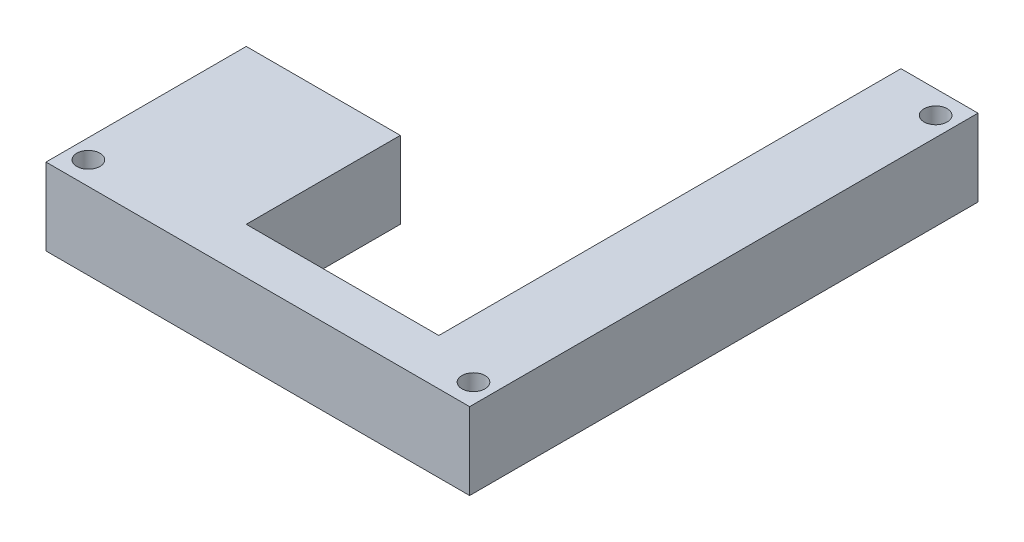
ISO-10303-21;
HEADER;
FILE_DESCRIPTION(('STEP AP214'),'2;1');
FILE_NAME('part.step','',(''),(''),'','','');
FILE_SCHEMA(('AUTOMOTIVE_DESIGN { 1 0 10303 214 1 1 1 1 }'));
ENDSEC;
DATA;
#1=APPLICATION_CONTEXT('core data for automotive mechanical design processes');
#2=APPLICATION_PROTOCOL_DEFINITION('international standard','automotive_design',2000,#1);
#3=PRODUCT_CONTEXT('',#1,'mechanical');
#4=PRODUCT('Part','Part','',(#3));
#5=PRODUCT_RELATED_PRODUCT_CATEGORY('part','',(#4));
#6=PRODUCT_DEFINITION_FORMATION('','',#4);
#7=PRODUCT_DEFINITION_CONTEXT('part definition',#1,'design');
#8=PRODUCT_DEFINITION('design','',#6,#7);
#9=PRODUCT_DEFINITION_SHAPE('','',#8);
#10=(LENGTH_UNIT() NAMED_UNIT(*) SI_UNIT(.MILLI.,.METRE.));
#11=(NAMED_UNIT(*) PLANE_ANGLE_UNIT() SI_UNIT($,.RADIAN.));
#12=(NAMED_UNIT(*) SI_UNIT($,.STERADIAN.) SOLID_ANGLE_UNIT());
#13=UNCERTAINTY_MEASURE_WITH_UNIT(LENGTH_MEASURE(1.E-05),#10,'distance_accuracy_value','');
#14=(GEOMETRIC_REPRESENTATION_CONTEXT(3) GLOBAL_UNCERTAINTY_ASSIGNED_CONTEXT((#13)) GLOBAL_UNIT_ASSIGNED_CONTEXT((#10,
#11,#12)) REPRESENTATION_CONTEXT('',''));
#15=CARTESIAN_POINT('',(0.,0.,0.));
#16=DIRECTION('',(0.,0.,1.));
#17=DIRECTION('',(1.,0.,0.));
#18=AXIS2_PLACEMENT_3D('',#15,#16,#17);
#19=CARTESIAN_POINT('',(0.,10.,0.));
#20=DIRECTION('',(0.,-1.,0.));
#21=DIRECTION('',(0.,0.,-1.));
#22=AXIS2_PLACEMENT_3D('',#19,#20,#21);
#23=PLANE('',#22);
#24=DIRECTION('',(0.,0.,1.));
#25=VECTOR('',#24,1.);
#26=CARTESIAN_POINT('',(5.28880866425992,10.,29.4918772563177));
#27=LINE('',#26,#25);
#28=CARTESIAN_POINT('',(5.28880866425992,10.,-30.5081227436823));
#29=VERTEX_POINT('',#28);
#30=CARTESIAN_POINT('',(5.28880866425992,10.,29.4918772563177));
#31=VERTEX_POINT('',#30);
#32=EDGE_CURVE('E145',#29,#31,#27,.T.);
#33=ORIENTED_EDGE('',*,*,#32,.T.);
#34=DIRECTION('',(-1.,0.,0.));
#35=VECTOR('',#34,1.);
#36=CARTESIAN_POINT('',(-19.7111913357401,10.,29.4918772563177));
#37=LINE('',#36,#35);
#38=CARTESIAN_POINT('',(-19.7111913357401,10.,29.4918772563177));
#39=VERTEX_POINT('',#38);
#40=EDGE_CURVE('E93',#31,#39,#37,.T.);
#41=ORIENTED_EDGE('',*,*,#40,.T.);
#42=DIRECTION('',(0.,0.,-1.));
#43=VECTOR('',#42,1.);
#44=CARTESIAN_POINT('',(-19.7111913357401,10.,9.49187725631768));
#45=LINE('',#44,#43);
#46=CARTESIAN_POINT('',(-19.7111913357401,10.,9.49187725631768));
#47=VERTEX_POINT('',#46);
#48=EDGE_CURVE('E160',#39,#47,#45,.T.);
#49=ORIENTED_EDGE('',*,*,#48,.T.);
#50=DIRECTION('',(-1.,0.,0.));
#51=VECTOR('',#50,1.);
#52=CARTESIAN_POINT('',(-39.7111913357401,10.,9.49187725631768));
#53=LINE('',#52,#51);
#54=CARTESIAN_POINT('',(-39.7111913357401,10.,9.49187725631768));
#55=VERTEX_POINT('',#54);
#56=EDGE_CURVE('E173',#47,#55,#53,.T.);
#57=ORIENTED_EDGE('',*,*,#56,.T.);
#58=DIRECTION('',(0.,0.,1.));
#59=VECTOR('',#58,1.);
#60=CARTESIAN_POINT('',(-39.7111913357401,10.,35.4918772563177));
#61=LINE('',#60,#59);
#62=CARTESIAN_POINT('',(-39.7111913357401,10.,35.4918772563177));
#63=VERTEX_POINT('',#62);
#64=EDGE_CURVE('E112',#55,#63,#61,.T.);
#65=ORIENTED_EDGE('',*,*,#64,.T.);
#66=DIRECTION('',(1.,0.,0.));
#67=VECTOR('',#66,1.);
#68=CARTESIAN_POINT('',(15.2888086642599,10.,35.4918772563177));
#69=LINE('',#68,#67);
#70=CARTESIAN_POINT('',(15.2888086642599,10.,35.4918772563177));
#71=VERTEX_POINT('',#70);
#72=EDGE_CURVE('E106',#63,#71,#69,.T.);
#73=ORIENTED_EDGE('',*,*,#72,.T.);
#74=DIRECTION('',(0.,0.,-1.));
#75=VECTOR('',#74,1.);
#76=CARTESIAN_POINT('',(15.2888086642599,10.,-30.5081227436823));
#77=LINE('',#76,#75);
#78=CARTESIAN_POINT('',(15.2888086642599,10.,-30.5081227436823));
#79=VERTEX_POINT('',#78);
#80=EDGE_CURVE('E110',#71,#79,#77,.T.);
#81=ORIENTED_EDGE('',*,*,#80,.T.);
#82=DIRECTION('',(-1.,0.,0.));
#83=VECTOR('',#82,1.);
#84=CARTESIAN_POINT('',(5.28880866425992,10.,-30.5081227436823));
#85=LINE('',#84,#83);
#86=EDGE_CURVE('E50',#79,#29,#85,.T.);
#87=ORIENTED_EDGE('',*,*,#86,.T.);
#88=EDGE_LOOP('',(#33,#41,#49,#57,#65,#73,#81,#87));
#89=FACE_BOUND('',#88,.T.);
#90=CARTESIAN_POINT('',(12.7888086642599,10.,32.4918772563177));
#91=DIRECTION('',(0.,1.,0.));
#92=DIRECTION('',(0.,0.,1.));
#93=AXIS2_PLACEMENT_3D('',#90,#91,#92);
#94=CIRCLE('',#93,1.5);
#95=CARTESIAN_POINT('',(12.7888086642599,10.,33.9918772563177));
#96=VERTEX_POINT('',#95);
#97=EDGE_CURVE('E134',#96,#96,#94,.T.);
#98=ORIENTED_EDGE('',*,*,#97,.F.);
#99=EDGE_LOOP('',(#98));
#100=FACE_BOUND('',#99,.T.);
#101=CARTESIAN_POINT('',(-37.2111913357401,10.,32.4918772563177));
#102=DIRECTION('',(0.,1.,0.));
#103=DIRECTION('',(0.,0.,1.));
#104=AXIS2_PLACEMENT_3D('',#101,#102,#103);
#105=CIRCLE('',#104,1.5);
#106=CARTESIAN_POINT('',(-37.2111913357401,10.,33.9918772563177));
#107=VERTEX_POINT('',#106);
#108=EDGE_CURVE('E182',#107,#107,#105,.T.);
#109=ORIENTED_EDGE('',*,*,#108,.F.);
#110=EDGE_LOOP('',(#109));
#111=FACE_BOUND('',#110,.T.);
#112=CARTESIAN_POINT('',(12.7888086642599,10.,-27.5081227436823));
#113=DIRECTION('',(0.,1.,0.));
#114=DIRECTION('',(0.,0.,1.));
#115=AXIS2_PLACEMENT_3D('',#112,#113,#114);
#116=CIRCLE('',#115,1.5);
#117=CARTESIAN_POINT('',(12.7888086642599,10.,-26.0081227436823));
#118=VERTEX_POINT('',#117);
#119=EDGE_CURVE('E188',#118,#118,#116,.T.);
#120=ORIENTED_EDGE('',*,*,#119,.F.);
#121=EDGE_LOOP('',(#120));
#122=FACE_BOUND('',#121,.T.);
#123=ADVANCED_FACE('F33',(#89,#100,#111,#122),#23,.F.);
#124=CARTESIAN_POINT('',(0.,0.,0.));
#125=DIRECTION('',(0.,-1.,0.));
#126=DIRECTION('',(0.,0.,-1.));
#127=AXIS2_PLACEMENT_3D('',#124,#125,#126);
#128=PLANE('',#127);
#129=CARTESIAN_POINT('',(-37.2111913357401,0.,32.4918772563177));
#130=DIRECTION('',(0.,1.,0.));
#131=DIRECTION('',(0.,0.,1.));
#132=AXIS2_PLACEMENT_3D('',#129,#130,#131);
#133=CIRCLE('',#132,1.5);
#134=CARTESIAN_POINT('',(-37.2111913357401,0.,33.9918772563177));
#135=VERTEX_POINT('',#134);
#136=EDGE_CURVE('E185',#135,#135,#133,.T.);
#137=ORIENTED_EDGE('',*,*,#136,.T.);
#138=EDGE_LOOP('',(#137));
#139=FACE_BOUND('',#138,.T.);
#140=DIRECTION('',(0.,0.,1.));
#141=VECTOR('',#140,1.);
#142=CARTESIAN_POINT('',(5.28880866425992,0.,29.4918772563177));
#143=LINE('',#142,#141);
#144=CARTESIAN_POINT('',(5.28880866425992,0.,-30.5081227436823));
#145=VERTEX_POINT('',#144);
#146=CARTESIAN_POINT('',(5.28880866425992,0.,29.4918772563177));
#147=VERTEX_POINT('',#146);
#148=EDGE_CURVE('E130',#145,#147,#143,.T.);
#149=ORIENTED_EDGE('',*,*,#148,.F.);
#150=DIRECTION('',(-1.,0.,0.));
#151=VECTOR('',#150,1.);
#152=CARTESIAN_POINT('',(5.28880866425992,0.,-30.5081227436823));
#153=LINE('',#152,#151);
#154=CARTESIAN_POINT('',(15.2888086642599,0.,-30.5081227436823));
#155=VERTEX_POINT('',#154);
#156=EDGE_CURVE('E85',#155,#145,#153,.T.);
#157=ORIENTED_EDGE('',*,*,#156,.F.);
#158=DIRECTION('',(0.,0.,-1.));
#159=VECTOR('',#158,1.);
#160=CARTESIAN_POINT('',(15.2888086642599,0.,-30.5081227436823));
#161=LINE('',#160,#159);
#162=CARTESIAN_POINT('',(15.2888086642599,0.,35.4918772563177));
#163=VERTEX_POINT('',#162);
#164=EDGE_CURVE('E79',#163,#155,#161,.T.);
#165=ORIENTED_EDGE('',*,*,#164,.F.);
#166=DIRECTION('',(1.,0.,0.));
#167=VECTOR('',#166,1.);
#168=CARTESIAN_POINT('',(15.2888086642599,0.,35.4918772563177));
#169=LINE('',#168,#167);
#170=CARTESIAN_POINT('',(-39.7111913357401,0.,35.4918772563177));
#171=VERTEX_POINT('',#170);
#172=EDGE_CURVE('E120',#171,#163,#169,.T.);
#173=ORIENTED_EDGE('',*,*,#172,.F.);
#174=DIRECTION('',(0.,0.,1.));
#175=VECTOR('',#174,1.);
#176=CARTESIAN_POINT('',(-39.7111913357401,0.,35.4918772563177));
#177=LINE('',#176,#175);
#178=CARTESIAN_POINT('',(-39.7111913357401,0.,9.49187725631768));
#179=VERTEX_POINT('',#178);
#180=EDGE_CURVE('E140',#179,#171,#177,.T.);
#181=ORIENTED_EDGE('',*,*,#180,.F.);
#182=DIRECTION('',(-1.,0.,0.));
#183=VECTOR('',#182,1.);
#184=CARTESIAN_POINT('',(-39.7111913357401,0.,9.49187725631768));
#185=LINE('',#184,#183);
#186=CARTESIAN_POINT('',(-19.7111913357401,0.,9.49187725631768));
#187=VERTEX_POINT('',#186);
#188=EDGE_CURVE('E138',#187,#179,#185,.T.);
#189=ORIENTED_EDGE('',*,*,#188,.F.);
#190=DIRECTION('',(0.,0.,-1.));
#191=VECTOR('',#190,1.);
#192=CARTESIAN_POINT('',(-19.7111913357401,0.,9.49187725631768));
#193=LINE('',#192,#191);
#194=CARTESIAN_POINT('',(-19.7111913357401,0.,29.4918772563177));
#195=VERTEX_POINT('',#194);
#196=EDGE_CURVE('E136',#195,#187,#193,.T.);
#197=ORIENTED_EDGE('',*,*,#196,.F.);
#198=DIRECTION('',(-1.,0.,0.));
#199=VECTOR('',#198,1.);
#200=CARTESIAN_POINT('',(-19.7111913357401,0.,29.4918772563177));
#201=LINE('',#200,#199);
#202=EDGE_CURVE('E133',#147,#195,#201,.T.);
#203=ORIENTED_EDGE('',*,*,#202,.F.);
#204=EDGE_LOOP('',(#149,#157,#165,#173,#181,#189,#197,#203));
#205=FACE_BOUND('',#204,.T.);
#206=CARTESIAN_POINT('',(12.7888086642599,0.,32.4918772563177));
#207=DIRECTION('',(0.,1.,0.));
#208=DIRECTION('',(0.,0.,1.));
#209=AXIS2_PLACEMENT_3D('',#206,#207,#208);
#210=CIRCLE('',#209,1.5);
#211=CARTESIAN_POINT('',(12.7888086642599,0.,33.9918772563177));
#212=VERTEX_POINT('',#211);
#213=EDGE_CURVE('E179',#212,#212,#210,.T.);
#214=ORIENTED_EDGE('',*,*,#213,.T.);
#215=EDGE_LOOP('',(#214));
#216=FACE_BOUND('',#215,.T.);
#217=CARTESIAN_POINT('',(12.7888086642599,0.,-27.5081227436823));
#218=DIRECTION('',(0.,1.,0.));
#219=DIRECTION('',(0.,0.,1.));
#220=AXIS2_PLACEMENT_3D('',#217,#218,#219);
#221=CIRCLE('',#220,1.5);
#222=CARTESIAN_POINT('',(12.7888086642599,0.,-26.0081227436823));
#223=VERTEX_POINT('',#222);
#224=EDGE_CURVE('E191',#223,#223,#221,.T.);
#225=ORIENTED_EDGE('',*,*,#224,.T.);
#226=EDGE_LOOP('',(#225));
#227=FACE_BOUND('',#226,.T.);
#228=ADVANCED_FACE('F164',(#139,#205,#216,#227),#128,.T.);
#229=CARTESIAN_POINT('',(5.28880866425992,10.,29.4918772563177));
#230=DIRECTION('',(1.,0.,0.));
#231=DIRECTION('',(0.,0.,-1.));
#232=AXIS2_PLACEMENT_3D('',#229,#230,#231);
#233=PLANE('',#232);
#234=ORIENTED_EDGE('',*,*,#148,.T.);
#235=DIRECTION('',(0.,-1.,0.));
#236=VECTOR('',#235,1.);
#237=CARTESIAN_POINT('',(5.28880866425992,10.,29.4918772563177));
#238=LINE('',#237,#236);
#239=EDGE_CURVE('E11',#31,#147,#238,.T.);
#240=ORIENTED_EDGE('',*,*,#239,.F.);
#241=ORIENTED_EDGE('',*,*,#32,.F.);
#242=DIRECTION('',(0.,-1.,0.));
#243=VECTOR('',#242,1.);
#244=CARTESIAN_POINT('',(5.28880866425992,10.,-30.5081227436823));
#245=LINE('',#244,#243);
#246=EDGE_CURVE('E126',#29,#145,#245,.T.);
#247=ORIENTED_EDGE('',*,*,#246,.T.);
#248=EDGE_LOOP('',(#234,#240,#241,#247));
#249=FACE_BOUND('',#248,.T.);
#250=ADVANCED_FACE('F35',(#249),#233,.F.);
#251=CARTESIAN_POINT('',(-19.7111913357401,10.,29.4918772563177));
#252=DIRECTION('',(0.,0.,1.));
#253=DIRECTION('',(1.,0.,0.));
#254=AXIS2_PLACEMENT_3D('',#251,#252,#253);
#255=PLANE('',#254);
#256=ORIENTED_EDGE('',*,*,#202,.T.);
#257=DIRECTION('',(0.,-1.,0.));
#258=VECTOR('',#257,1.);
#259=CARTESIAN_POINT('',(-19.7111913357401,10.,29.4918772563177));
#260=LINE('',#259,#258);
#261=EDGE_CURVE('E42',#39,#195,#260,.T.);
#262=ORIENTED_EDGE('',*,*,#261,.F.);
#263=ORIENTED_EDGE('',*,*,#40,.F.);
#264=ORIENTED_EDGE('',*,*,#239,.T.);
#265=EDGE_LOOP('',(#256,#262,#263,#264));
#266=FACE_BOUND('',#265,.T.);
#267=ADVANCED_FACE('F223',(#266),#255,.F.);
#268=CARTESIAN_POINT('',(-19.7111913357401,10.,9.49187725631768));
#269=DIRECTION('',(-1.,0.,0.));
#270=DIRECTION('',(0.,0.,1.));
#271=AXIS2_PLACEMENT_3D('',#268,#269,#270);
#272=PLANE('',#271);
#273=ORIENTED_EDGE('',*,*,#196,.T.);
#274=DIRECTION('',(0.,-1.,0.));
#275=VECTOR('',#274,1.);
#276=CARTESIAN_POINT('',(-19.7111913357401,10.,9.49187725631768));
#277=LINE('',#276,#275);
#278=EDGE_CURVE('E152',#47,#187,#277,.T.);
#279=ORIENTED_EDGE('',*,*,#278,.F.);
#280=ORIENTED_EDGE('',*,*,#48,.F.);
#281=ORIENTED_EDGE('',*,*,#261,.T.);
#282=EDGE_LOOP('',(#273,#279,#280,#281));
#283=FACE_BOUND('',#282,.T.);
#284=ADVANCED_FACE('F158',(#283),#272,.F.);
#285=CARTESIAN_POINT('',(-39.7111913357401,10.,9.49187725631768));
#286=DIRECTION('',(0.,0.,1.));
#287=DIRECTION('',(1.,0.,0.));
#288=AXIS2_PLACEMENT_3D('',#285,#286,#287);
#289=PLANE('',#288);
#290=ORIENTED_EDGE('',*,*,#188,.T.);
#291=DIRECTION('',(0.,-1.,0.));
#292=VECTOR('',#291,1.);
#293=CARTESIAN_POINT('',(-39.7111913357401,10.,9.49187725631768));
#294=LINE('',#293,#292);
#295=EDGE_CURVE('E149',#55,#179,#294,.T.);
#296=ORIENTED_EDGE('',*,*,#295,.F.);
#297=ORIENTED_EDGE('',*,*,#56,.F.);
#298=ORIENTED_EDGE('',*,*,#278,.T.);
#299=EDGE_LOOP('',(#290,#296,#297,#298));
#300=FACE_BOUND('',#299,.T.);
#301=ADVANCED_FACE('F169',(#300),#289,.F.);
#302=CARTESIAN_POINT('',(-39.7111913357401,10.,35.4918772563177));
#303=DIRECTION('',(1.,0.,0.));
#304=DIRECTION('',(0.,0.,-1.));
#305=AXIS2_PLACEMENT_3D('',#302,#303,#304);
#306=PLANE('',#305);
#307=ORIENTED_EDGE('',*,*,#180,.T.);
#308=DIRECTION('',(0.,-1.,0.));
#309=VECTOR('',#308,1.);
#310=CARTESIAN_POINT('',(-39.7111913357401,10.,35.4918772563177));
#311=LINE('',#310,#309);
#312=EDGE_CURVE('E121',#63,#171,#311,.T.);
#313=ORIENTED_EDGE('',*,*,#312,.F.);
#314=ORIENTED_EDGE('',*,*,#64,.F.);
#315=ORIENTED_EDGE('',*,*,#295,.T.);
#316=EDGE_LOOP('',(#307,#313,#314,#315));
#317=FACE_BOUND('',#316,.T.);
#318=ADVANCED_FACE('F172',(#317),#306,.F.);
#319=CARTESIAN_POINT('',(15.2888086642599,10.,35.4918772563177));
#320=DIRECTION('',(0.,0.,-1.));
#321=DIRECTION('',(-1.,0.,0.));
#322=AXIS2_PLACEMENT_3D('',#319,#320,#321);
#323=PLANE('',#322);
#324=ORIENTED_EDGE('',*,*,#172,.T.);
#325=DIRECTION('',(0.,-1.,0.));
#326=VECTOR('',#325,1.);
#327=CARTESIAN_POINT('',(15.2888086642599,10.,35.4918772563177));
#328=LINE('',#327,#326);
#329=EDGE_CURVE('E117',#71,#163,#328,.T.);
#330=ORIENTED_EDGE('',*,*,#329,.F.);
#331=ORIENTED_EDGE('',*,*,#72,.F.);
#332=ORIENTED_EDGE('',*,*,#312,.T.);
#333=EDGE_LOOP('',(#324,#330,#331,#332));
#334=FACE_BOUND('',#333,.T.);
#335=ADVANCED_FACE('F118',(#334),#323,.F.);
#336=CARTESIAN_POINT('',(15.2888086642599,10.,-30.5081227436823));
#337=DIRECTION('',(-1.,0.,0.));
#338=DIRECTION('',(0.,0.,1.));
#339=AXIS2_PLACEMENT_3D('',#336,#337,#338);
#340=PLANE('',#339);
#341=ORIENTED_EDGE('',*,*,#164,.T.);
#342=DIRECTION('',(0.,-1.,0.));
#343=VECTOR('',#342,1.);
#344=CARTESIAN_POINT('',(15.2888086642599,10.,-30.5081227436823));
#345=LINE('',#344,#343);
#346=EDGE_CURVE('E122',#79,#155,#345,.T.);
#347=ORIENTED_EDGE('',*,*,#346,.F.);
#348=ORIENTED_EDGE('',*,*,#80,.F.);
#349=ORIENTED_EDGE('',*,*,#329,.T.);
#350=EDGE_LOOP('',(#341,#347,#348,#349));
#351=FACE_BOUND('',#350,.T.);
#352=ADVANCED_FACE('F124',(#351),#340,.F.);
#353=CARTESIAN_POINT('',(5.28880866425992,10.,-30.5081227436823));
#354=DIRECTION('',(0.,0.,1.));
#355=DIRECTION('',(1.,0.,0.));
#356=AXIS2_PLACEMENT_3D('',#353,#354,#355);
#357=PLANE('',#356);
#358=ORIENTED_EDGE('',*,*,#156,.T.);
#359=ORIENTED_EDGE('',*,*,#246,.F.);
#360=ORIENTED_EDGE('',*,*,#86,.F.);
#361=ORIENTED_EDGE('',*,*,#346,.T.);
#362=EDGE_LOOP('',(#358,#359,#360,#361));
#363=FACE_BOUND('',#362,.T.);
#364=ADVANCED_FACE('F211',(#363),#357,.F.);
#365=CARTESIAN_POINT('',(12.7888086642599,10.,32.4918772563177));
#366=DIRECTION('',(0.,-1.,0.));
#367=DIRECTION('',(0.,0.,-1.));
#368=AXIS2_PLACEMENT_3D('',#365,#366,#367);
#369=CYLINDRICAL_SURFACE('',#368,1.5);
#370=ORIENTED_EDGE('',*,*,#97,.T.);
#371=EDGE_LOOP('',(#370));
#372=FACE_BOUND('',#371,.T.);
#373=ORIENTED_EDGE('',*,*,#213,.F.);
#374=EDGE_LOOP('',(#373));
#375=FACE_BOUND('',#374,.T.);
#376=ADVANCED_FACE('F208',(#372,#375),#369,.F.);
#377=CARTESIAN_POINT('',(-37.2111913357401,10.,32.4918772563177));
#378=DIRECTION('',(0.,-1.,0.));
#379=DIRECTION('',(0.,0.,-1.));
#380=AXIS2_PLACEMENT_3D('',#377,#378,#379);
#381=CYLINDRICAL_SURFACE('',#380,1.5);
#382=ORIENTED_EDGE('',*,*,#108,.T.);
#383=EDGE_LOOP('',(#382));
#384=FACE_BOUND('',#383,.T.);
#385=ORIENTED_EDGE('',*,*,#136,.F.);
#386=EDGE_LOOP('',(#385));
#387=FACE_BOUND('',#386,.T.);
#388=ADVANCED_FACE('F287',(#384,#387),#381,.F.);
#389=CARTESIAN_POINT('',(12.7888086642599,10.,-27.5081227436823));
#390=DIRECTION('',(0.,-1.,0.));
#391=DIRECTION('',(0.,0.,-1.));
#392=AXIS2_PLACEMENT_3D('',#389,#390,#391);
#393=CYLINDRICAL_SURFACE('',#392,1.5);
#394=ORIENTED_EDGE('',*,*,#119,.T.);
#395=EDGE_LOOP('',(#394));
#396=FACE_BOUND('',#395,.T.);
#397=ORIENTED_EDGE('',*,*,#224,.F.);
#398=EDGE_LOOP('',(#397));
#399=FACE_BOUND('',#398,.T.);
#400=ADVANCED_FACE('F197',(#396,#399),#393,.F.);
#401=CLOSED_SHELL('',(#123,#228,#250,#267,#284,#301,#318,#335,#352,#364,#376,#388,#400));
#402=MANIFOLD_SOLID_BREP('B2',#401);
#403=ADVANCED_BREP_SHAPE_REPRESENTATION('',(#18,#402),#14);
#404=SHAPE_DEFINITION_REPRESENTATION(#9,#403);
ENDSEC;
END-ISO-10303-21;
